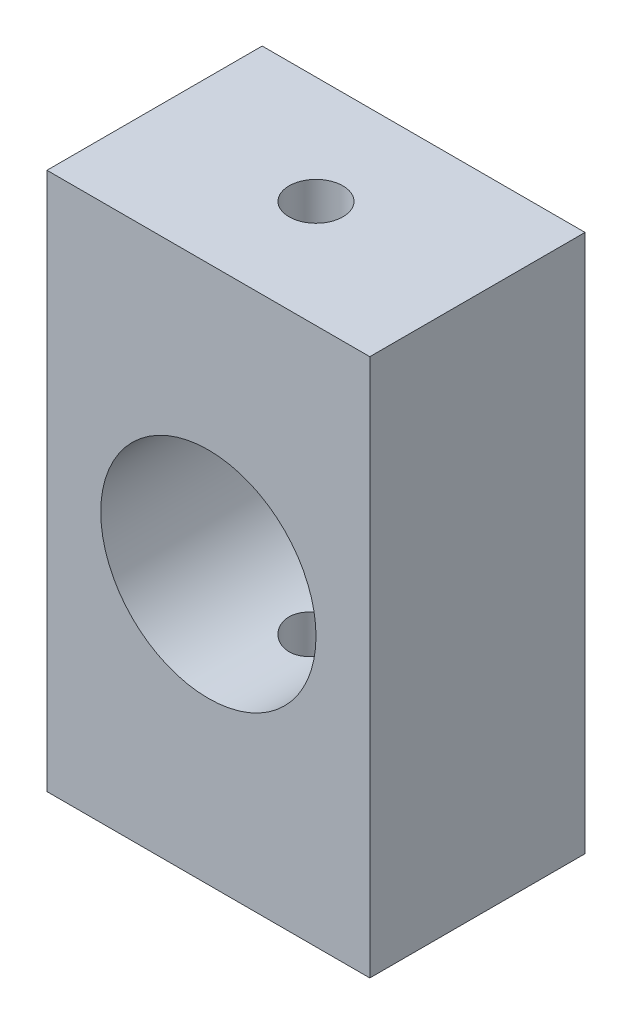
ISO-10303-21;
HEADER;
FILE_DESCRIPTION(('STEP AP214'),'2;1');
FILE_NAME('part.step','',(''),(''),'','','');
FILE_SCHEMA(('AUTOMOTIVE_DESIGN { 1 0 10303 214 1 1 1 1 }'));
ENDSEC;
DATA;
#1=APPLICATION_CONTEXT('core data for automotive mechanical design processes');
#2=APPLICATION_PROTOCOL_DEFINITION('international standard','automotive_design',2000,#1);
#3=PRODUCT_CONTEXT('',#1,'mechanical');
#4=PRODUCT('Part','Part','',(#3));
#5=PRODUCT_RELATED_PRODUCT_CATEGORY('part','',(#4));
#6=PRODUCT_DEFINITION_FORMATION('','',#4);
#7=PRODUCT_DEFINITION_CONTEXT('part definition',#1,'design');
#8=PRODUCT_DEFINITION('design','',#6,#7);
#9=PRODUCT_DEFINITION_SHAPE('','',#8);
#10=(LENGTH_UNIT() NAMED_UNIT(*) SI_UNIT(.MILLI.,.METRE.));
#11=(NAMED_UNIT(*) PLANE_ANGLE_UNIT() SI_UNIT($,.RADIAN.));
#12=(NAMED_UNIT(*) SI_UNIT($,.STERADIAN.) SOLID_ANGLE_UNIT());
#13=UNCERTAINTY_MEASURE_WITH_UNIT(LENGTH_MEASURE(1.E-05),#10,'distance_accuracy_value','');
#14=(GEOMETRIC_REPRESENTATION_CONTEXT(3) GLOBAL_UNCERTAINTY_ASSIGNED_CONTEXT((#13)) GLOBAL_UNIT_ASSIGNED_CONTEXT((#10,
#11,#12)) REPRESENTATION_CONTEXT('',''));
#15=CARTESIAN_POINT('',(0.,0.,0.));
#16=DIRECTION('',(0.,0.,1.));
#17=DIRECTION('',(1.,0.,0.));
#18=AXIS2_PLACEMENT_3D('',#15,#16,#17);
#19=CARTESIAN_POINT('',(0.,0.,20.));
#20=DIRECTION('',(0.,0.,1.));
#21=DIRECTION('',(1.,0.,0.));
#22=AXIS2_PLACEMENT_3D('',#19,#20,#21);
#23=PLANE('',#22);
#24=DIRECTION('',(0.,-1.,0.));
#25=VECTOR('',#24,1.);
#26=CARTESIAN_POINT('',(-15.,25.,20.));
#27=LINE('',#26,#25);
#28=CARTESIAN_POINT('',(-15.,25.,20.));
#29=VERTEX_POINT('',#28);
#30=CARTESIAN_POINT('',(-15.,-25.,20.));
#31=VERTEX_POINT('',#30);
#32=EDGE_CURVE('E101',#29,#31,#27,.T.);
#33=ORIENTED_EDGE('',*,*,#32,.T.);
#34=DIRECTION('',(1.,0.,0.));
#35=VECTOR('',#34,1.);
#36=CARTESIAN_POINT('',(-15.,-25.,20.));
#37=LINE('',#36,#35);
#38=CARTESIAN_POINT('',(15.,-25.,20.));
#39=VERTEX_POINT('',#38);
#40=EDGE_CURVE('E96',#31,#39,#37,.T.);
#41=ORIENTED_EDGE('',*,*,#40,.T.);
#42=DIRECTION('',(0.,1.,0.));
#43=VECTOR('',#42,1.);
#44=CARTESIAN_POINT('',(15.,25.,20.));
#45=LINE('',#44,#43);
#46=CARTESIAN_POINT('',(15.,25.,20.));
#47=VERTEX_POINT('',#46);
#48=EDGE_CURVE('E99',#39,#47,#45,.T.);
#49=ORIENTED_EDGE('',*,*,#48,.T.);
#50=DIRECTION('',(-1.,0.,0.));
#51=VECTOR('',#50,1.);
#52=CARTESIAN_POINT('',(-15.,25.,20.));
#53=LINE('',#52,#51);
#54=EDGE_CURVE('E66',#47,#29,#53,.T.);
#55=ORIENTED_EDGE('',*,*,#54,.T.);
#56=EDGE_LOOP('',(#33,#41,#49,#55));
#57=FACE_BOUND('',#56,.T.);
#58=CARTESIAN_POINT('',(0.,0.,20.));
#59=DIRECTION('',(0.,0.,1.));
#60=DIRECTION('',(1.,0.,0.));
#61=AXIS2_PLACEMENT_3D('',#58,#59,#60);
#62=CIRCLE('',#61,10.);
#63=CARTESIAN_POINT('',(10.,0.,20.));
#64=VERTEX_POINT('',#63);
#65=EDGE_CURVE('E122',#64,#64,#62,.T.);
#66=ORIENTED_EDGE('',*,*,#65,.F.);
#67=EDGE_LOOP('',(#66));
#68=FACE_BOUND('',#67,.T.);
#69=ADVANCED_FACE('F41',(#57,#68),#23,.T.);
#70=CARTESIAN_POINT('',(0.,0.,0.));
#71=DIRECTION('',(0.,0.,1.));
#72=DIRECTION('',(1.,0.,0.));
#73=AXIS2_PLACEMENT_3D('',#70,#71,#72);
#74=PLANE('',#73);
#75=DIRECTION('',(0.,-1.,0.));
#76=VECTOR('',#75,1.);
#77=CARTESIAN_POINT('',(-15.,25.,0.));
#78=LINE('',#77,#76);
#79=CARTESIAN_POINT('',(-15.,25.,0.));
#80=VERTEX_POINT('',#79);
#81=CARTESIAN_POINT('',(-15.,-25.,0.));
#82=VERTEX_POINT('',#81);
#83=EDGE_CURVE('E118',#80,#82,#78,.T.);
#84=ORIENTED_EDGE('',*,*,#83,.F.);
#85=DIRECTION('',(-1.,0.,0.));
#86=VECTOR('',#85,1.);
#87=CARTESIAN_POINT('',(-15.,25.,0.));
#88=LINE('',#87,#86);
#89=CARTESIAN_POINT('',(15.,25.,0.));
#90=VERTEX_POINT('',#89);
#91=EDGE_CURVE('E89',#90,#80,#88,.T.);
#92=ORIENTED_EDGE('',*,*,#91,.F.);
#93=DIRECTION('',(0.,1.,0.));
#94=VECTOR('',#93,1.);
#95=CARTESIAN_POINT('',(15.,25.,0.));
#96=LINE('',#95,#94);
#97=CARTESIAN_POINT('',(15.,-25.,0.));
#98=VERTEX_POINT('',#97);
#99=EDGE_CURVE('E83',#98,#90,#96,.T.);
#100=ORIENTED_EDGE('',*,*,#99,.F.);
#101=DIRECTION('',(1.,0.,0.));
#102=VECTOR('',#101,1.);
#103=CARTESIAN_POINT('',(-15.,-25.,0.));
#104=LINE('',#103,#102);
#105=EDGE_CURVE('E106',#82,#98,#104,.T.);
#106=ORIENTED_EDGE('',*,*,#105,.F.);
#107=EDGE_LOOP('',(#84,#92,#100,#106));
#108=FACE_BOUND('',#107,.T.);
#109=CARTESIAN_POINT('',(0.,0.,0.));
#110=DIRECTION('',(0.,0.,1.));
#111=DIRECTION('',(1.,0.,0.));
#112=AXIS2_PLACEMENT_3D('',#109,#110,#111);
#113=CIRCLE('',#112,10.);
#114=CARTESIAN_POINT('',(10.,0.,0.));
#115=VERTEX_POINT('',#114);
#116=EDGE_CURVE('E187',#115,#115,#113,.T.);
#117=ORIENTED_EDGE('',*,*,#116,.T.);
#118=EDGE_LOOP('',(#117));
#119=FACE_BOUND('',#118,.T.);
#120=ADVANCED_FACE('F157',(#108,#119),#74,.F.);
#121=CARTESIAN_POINT('',(-15.,25.,20.));
#122=DIRECTION('',(1.,0.,0.));
#123=DIRECTION('',(0.,1.,0.));
#124=AXIS2_PLACEMENT_3D('',#121,#122,#123);
#125=PLANE('',#124);
#126=ORIENTED_EDGE('',*,*,#83,.T.);
#127=DIRECTION('',(0.,0.,-1.));
#128=VECTOR('',#127,1.);
#129=CARTESIAN_POINT('',(-15.,-25.,20.));
#130=LINE('',#129,#128);
#131=EDGE_CURVE('E11',#31,#82,#130,.T.);
#132=ORIENTED_EDGE('',*,*,#131,.F.);
#133=ORIENTED_EDGE('',*,*,#32,.F.);
#134=DIRECTION('',(0.,0.,-1.));
#135=VECTOR('',#134,1.);
#136=CARTESIAN_POINT('',(-15.,25.,20.));
#137=LINE('',#136,#135);
#138=EDGE_CURVE('E114',#29,#80,#137,.T.);
#139=ORIENTED_EDGE('',*,*,#138,.T.);
#140=EDGE_LOOP('',(#126,#132,#133,#139));
#141=FACE_BOUND('',#140,.T.);
#142=ADVANCED_FACE('F43',(#141),#125,.F.);
#143=CARTESIAN_POINT('',(-15.,-25.,20.));
#144=DIRECTION('',(0.,1.,0.));
#145=DIRECTION('',(0.,0.,1.));
#146=AXIS2_PLACEMENT_3D('',#143,#144,#145);
#147=PLANE('',#146);
#148=CARTESIAN_POINT('',(0.,-25.,10.));
#149=DIRECTION('',(0.,1.,0.));
#150=DIRECTION('',(0.,0.,1.));
#151=AXIS2_PLACEMENT_3D('',#148,#149,#150);
#152=CIRCLE('',#151,2.5);
#153=CARTESIAN_POINT('',(0.,-25.,12.5));
#154=VERTEX_POINT('',#153);
#155=EDGE_CURVE('E138',#154,#154,#152,.F.);
#156=ORIENTED_EDGE('',*,*,#155,.F.);
#157=EDGE_LOOP('',(#156));
#158=FACE_BOUND('',#157,.T.);
#159=ORIENTED_EDGE('',*,*,#105,.T.);
#160=DIRECTION('',(0.,0.,-1.));
#161=VECTOR('',#160,1.);
#162=CARTESIAN_POINT('',(15.,-25.,20.));
#163=LINE('',#162,#161);
#164=EDGE_CURVE('E57',#39,#98,#163,.T.);
#165=ORIENTED_EDGE('',*,*,#164,.F.);
#166=ORIENTED_EDGE('',*,*,#40,.F.);
#167=ORIENTED_EDGE('',*,*,#131,.T.);
#168=EDGE_LOOP('',(#159,#165,#166,#167));
#169=FACE_BOUND('',#168,.T.);
#170=ADVANCED_FACE('F105',(#158,#169),#147,.F.);
#171=CARTESIAN_POINT('',(15.,25.,20.));
#172=DIRECTION('',(-1.,0.,0.));
#173=DIRECTION('',(0.,-1.,0.));
#174=AXIS2_PLACEMENT_3D('',#171,#172,#173);
#175=PLANE('',#174);
#176=ORIENTED_EDGE('',*,*,#99,.T.);
#177=DIRECTION('',(0.,0.,-1.));
#178=VECTOR('',#177,1.);
#179=CARTESIAN_POINT('',(15.,25.,20.));
#180=LINE('',#179,#178);
#181=EDGE_CURVE('E108',#47,#90,#180,.T.);
#182=ORIENTED_EDGE('',*,*,#181,.F.);
#183=ORIENTED_EDGE('',*,*,#48,.F.);
#184=ORIENTED_EDGE('',*,*,#164,.T.);
#185=EDGE_LOOP('',(#176,#182,#183,#184));
#186=FACE_BOUND('',#185,.T.);
#187=ADVANCED_FACE('F110',(#186),#175,.F.);
#188=CARTESIAN_POINT('',(-15.,25.,20.));
#189=DIRECTION('',(0.,-1.,0.));
#190=DIRECTION('',(1.,0.,0.));
#191=AXIS2_PLACEMENT_3D('',#188,#189,#190);
#192=PLANE('',#191);
#193=CARTESIAN_POINT('',(0.,25.,10.));
#194=DIRECTION('',(0.,1.,0.));
#195=DIRECTION('',(-1.,0.,0.));
#196=AXIS2_PLACEMENT_3D('',#193,#194,#195);
#197=CIRCLE('',#196,2.5);
#198=CARTESIAN_POINT('',(-2.5,25.,10.));
#199=VERTEX_POINT('',#198);
#200=EDGE_CURVE('E178',#199,#199,#197,.T.);
#201=ORIENTED_EDGE('',*,*,#200,.F.);
#202=EDGE_LOOP('',(#201));
#203=FACE_BOUND('',#202,.T.);
#204=ORIENTED_EDGE('',*,*,#91,.T.);
#205=ORIENTED_EDGE('',*,*,#138,.F.);
#206=ORIENTED_EDGE('',*,*,#54,.F.);
#207=ORIENTED_EDGE('',*,*,#181,.T.);
#208=EDGE_LOOP('',(#204,#205,#206,#207));
#209=FACE_BOUND('',#208,.T.);
#210=ADVANCED_FACE('F153',(#203,#209),#192,.F.);
#211=CARTESIAN_POINT('',(0.,0.,20.));
#212=DIRECTION('',(0.,0.,-1.));
#213=DIRECTION('',(-1.,0.,0.));
#214=AXIS2_PLACEMENT_3D('',#211,#212,#213);
#215=CYLINDRICAL_SURFACE('',#214,10.);
#216=CARTESIAN_POINT('',(-2.5,-9.68245836551855,10.));
#217=CARTESIAN_POINT('',(-2.49999607859307,-9.68246100087861,10.1380507509266));
#218=CARTESIAN_POINT('',(-2.48852624549765,-9.68544306014597,10.2761448986785));
#219=CARTESIAN_POINT('',(-2.44302312546379,-9.69701861992564,10.5483675781735));
#220=CARTESIAN_POINT('',(-2.40897670674211,-9.7056153862163,10.6824937544682));
#221=CARTESIAN_POINT('',(-2.31949119963204,-9.7273872459615,10.9428035381872));
#222=CARTESIAN_POINT('',(-2.26407972785449,-9.74055642690458,11.0689971553857));
#223=CARTESIAN_POINT('',(-2.13352114126139,-9.76998192028759,11.3103108525399));
#224=CARTESIAN_POINT('',(-2.05837318856069,-9.78623836378489,11.4254304620802));
#225=CARTESIAN_POINT('',(-1.88870842731188,-9.82040716355625,11.6438616452622));
#226=CARTESIAN_POINT('',(-1.79383688770405,-9.83834597623034,11.74689360035));
#227=CARTESIAN_POINT('',(-1.58818206410066,-9.87362875515294,11.9357613943603));
#228=CARTESIAN_POINT('',(-1.47739729418031,-9.89097266566388,12.0215956256217));
#229=CARTESIAN_POINT('',(-1.24114520107895,-9.92340415520582,12.1747754676313));
#230=CARTESIAN_POINT('',(-1.11549457619512,-9.93845687400592,12.2418463881615));
#231=CARTESIAN_POINT('',(-0.854263184292762,-9.96430811925984,12.3538096441531));
#232=CARTESIAN_POINT('',(-0.71868388579194,-9.97510727334345,12.3987052519155));
#233=CARTESIAN_POINT('',(-0.444358758754161,-9.9910475884818,12.4641478345786));
#234=CARTESIAN_POINT('',(-0.305732719548975,-9.99629893844314,12.4851696443266));
#235=CARTESIAN_POINT('',(-0.0268288192627694,-10.000935941073,12.5037583792756));
#236=CARTESIAN_POINT('',(0.113448794538068,-10.000322460967,12.5013287722096));
#237=CARTESIAN_POINT('',(0.388380617930968,-9.99338094953534,12.4734251497499));
#238=CARTESIAN_POINT('',(0.523090539002667,-9.98718002340871,12.4484636749461));
#239=CARTESIAN_POINT('',(0.786345618534215,-9.96990836524857,12.3770287299515));
#240=CARTESIAN_POINT('',(0.914890448426094,-9.95883737398452,12.3305541146226));
#241=CARTESIAN_POINT('',(1.16351675875452,-9.93287509700884,12.2169974293129));
#242=CARTESIAN_POINT('',(1.28351127441626,-9.91795019695011,12.1497329553383));
#243=CARTESIAN_POINT('',(1.51068905585122,-9.88589903809692,11.9966443208837));
#244=CARTESIAN_POINT('',(1.61787008771376,-9.8687723965265,11.9108169314394));
#245=CARTESIAN_POINT('',(1.81943508771239,-9.83363713769356,11.7202912580176));
#246=CARTESIAN_POINT('',(1.91339419768799,-9.81561719525297,11.6151451076523));
#247=CARTESIAN_POINT('',(2.08244093990755,-9.78115043517327,11.3904000264597));
#248=CARTESIAN_POINT('',(2.15752769011507,-9.76470369108289,11.2708004205089));
#249=CARTESIAN_POINT('',(2.28697032255647,-9.73520496829319,11.0197099658511));
#250=CARTESIAN_POINT('',(2.34122391742612,-9.72216983717007,10.8881642696872));
#251=CARTESIAN_POINT('',(2.42671405159095,-9.70118640148669,10.6174145319232));
#252=CARTESIAN_POINT('',(2.45795551638266,-9.69323700842733,10.4782121360154));
#253=CARTESIAN_POINT('',(2.49582963866592,-9.68355356007457,10.2000404984701));
#254=CARTESIAN_POINT('',(2.50309047391912,-9.68166088976933,10.061162206659));
#255=CARTESIAN_POINT('',(2.49451699051516,-9.68387343364692,9.78417806341474));
#256=CARTESIAN_POINT('',(2.4786847978498,-9.687978095703,9.64607214205056));
#257=CARTESIAN_POINT('',(2.42492546393825,-9.7015708198498,9.37688573505143));
#258=CARTESIAN_POINT('',(2.3873640682819,-9.71096970242532,9.2457272734308));
#259=CARTESIAN_POINT('',(2.29161808167046,-9.73400718262805,8.99156854214667));
#260=CARTESIAN_POINT('',(2.2334310477125,-9.74764628246408,8.86856924094421));
#261=CARTESIAN_POINT('',(2.0967706679366,-9.77796137095511,8.6315587221331));
#262=CARTESIAN_POINT('',(2.01792175383564,-9.79469168607245,8.51777115995702));
#263=CARTESIAN_POINT('',(1.84265073233613,-9.82917083071113,8.30481163719853));
#264=CARTESIAN_POINT('',(1.74622573701359,-9.84691982728307,8.20564208334989));
#265=CARTESIAN_POINT('',(1.53565680246182,-9.88197403031774,8.02218895742908));
#266=CARTESIAN_POINT('',(1.42112988132898,-9.8992570206188,7.9383399374512));
#267=CARTESIAN_POINT('',(1.17925670673669,-9.93097216613689,7.79106413304875));
#268=CARTESIAN_POINT('',(1.05191112239398,-9.94540447003949,7.72763628339179));
#269=CARTESIAN_POINT('',(0.788895504327726,-9.96970115738325,7.62355396547207));
#270=CARTESIAN_POINT('',(0.653293452569705,-9.97959830022409,7.58273571562094));
#271=CARTESIAN_POINT('',(0.376874400797017,-9.99385293395789,7.52453966539159));
#272=CARTESIAN_POINT('',(0.236058412603101,-9.99821149393422,7.50715734126096));
#273=CARTESIAN_POINT('',(-0.0427088161083088,-10.0008542352202,7.49658102606115));
#274=CARTESIAN_POINT('',(-0.180634567415055,-9.99929947199971,7.50274572726148));
#275=CARTESIAN_POINT('',(-0.453418741036878,-9.99064741143608,7.53761956823587));
#276=CARTESIAN_POINT('',(-0.588277254452322,-9.98355027892922,7.56632803753292));
#277=CARTESIAN_POINT('',(-0.850427589111936,-9.96463582134723,7.64513054942715));
#278=CARTESIAN_POINT('',(-0.977756236452158,-9.95284411255981,7.69510863328595));
#279=CARTESIAN_POINT('',(-1.22229263260406,-9.92578222284145,7.81492644754893));
#280=CARTESIAN_POINT('',(-1.33949910316408,-9.91051160346894,7.88476868167621));
#281=CARTESIAN_POINT('',(-1.56350482105826,-9.87768124200718,8.04428808499033));
#282=CARTESIAN_POINT('',(-1.66998747074584,-9.86007542354161,8.13440035725957));
#283=CARTESIAN_POINT('',(-1.86653755068376,-9.82476622642974,8.33105712994336));
#284=CARTESIAN_POINT('',(-1.95660081269148,-9.80706282418256,8.4376057902779));
#285=CARTESIAN_POINT('',(-2.11940506617958,-9.77318689613756,8.66650353547365));
#286=CARTESIAN_POINT('',(-2.19179154854095,-9.75704909183222,8.78911030841313));
#287=CARTESIAN_POINT('',(-2.31481724146367,-9.7285988873707,9.04513872468704));
#288=CARTESIAN_POINT('',(-2.36547227438038,-9.71628370583034,9.17855241523461));
#289=CARTESIAN_POINT('',(-2.43605632142751,-9.69879771876843,9.4264425295879));
#290=CARTESIAN_POINT('',(-2.4599829264922,-9.69271657508747,9.53973291096534));
#291=CARTESIAN_POINT('',(-2.49195573142943,-9.68454596456551,9.76867217249422));
#292=CARTESIAN_POINT('',(-2.50000328592938,-9.6824561572277,9.88432085061101));
#293=CARTESIAN_POINT('',(-2.5,-9.68245836551855,10.));
#294=B_SPLINE_CURVE_WITH_KNOTS('',3,(#216,#217,#218,#219,#220,#221,#222,#223,#224,#225,#226,
#227,#228,#229,#230,#231,#232,#233,#234,#235,#236,#237,#238,#239,#240,#241,#242,#243,#244,#245,
#246,#247,#248,#249,#250,#251,#252,#253,#254,#255,#256,#257,#258,#259,#260,#261,#262,#263,#264,
#265,#266,#267,#268,#269,#270,#271,#272,#273,#274,#275,#276,#277,#278,#279,#280,#281,#282,#283,
#284,#285,#286,#287,#288,#289,#290,#291,#292,#293),.UNSPECIFIED.,.T.,.F.,(4,2,2,2,2,2,2,2,2,2,2,
2,2,2,2,2,2,2,2,2,2,2,2,2,2,2,2,2,2,2,2,2,2,2,2,2,2,2,4),(0.,0.413727441736135,
0.827695741428666,1.24113072716602,1.65458326755479,2.07623954192976,2.49793521479867,
2.9255149639792,3.35303159847092,3.77188750995347,4.19068148666021,4.60018262688947,
5.00970556724786,5.42292874254445,5.83622385468913,6.26070466571912,6.68520531199802,
7.11176432008403,7.53823200129548,7.95343574764205,8.36860127188747,8.77697405014152,
9.18539521426363,9.60182845864102,10.0183301888999,10.4452533097026,10.872154157245,
11.2959207281187,11.7196054891398,12.131834461324,12.5440511738193,12.9540487656466,
13.3640980574302,13.7839709658702,14.2039503157045,14.6317647729113,15.0592672137501,
15.4059782718573,15.7526597510792),.UNSPECIFIED.);
#295=CARTESIAN_POINT('',(-2.5,-9.68245836551855,10.));
#296=VERTEX_POINT('',#295);
#297=EDGE_CURVE('E45',#296,#296,#294,.T.);
#298=ORIENTED_EDGE('',*,*,#297,.F.);
#299=EDGE_LOOP('',(#298));
#300=FACE_BOUND('',#299,.T.);
#301=CARTESIAN_POINT('',(-2.5,9.68245836551854,10.));
#302=CARTESIAN_POINT('',(-2.49999607859307,9.68246100087859,9.86194924907343));
#303=CARTESIAN_POINT('',(-2.48852624549765,9.68544306014597,9.72385510132148));
#304=CARTESIAN_POINT('',(-2.44302312546379,9.69701861992564,9.45163242182649));
#305=CARTESIAN_POINT('',(-2.40897670674211,9.7056153862163,9.31750624553182));
#306=CARTESIAN_POINT('',(-2.31949119963204,9.7273872459615,9.05719646181282));
#307=CARTESIAN_POINT('',(-2.26407972785449,9.74055642690458,8.93100284461429));
#308=CARTESIAN_POINT('',(-2.13352114126139,9.76998192028759,8.68968914746012));
#309=CARTESIAN_POINT('',(-2.05837318856069,9.78623836378489,8.57456953791979));
#310=CARTESIAN_POINT('',(-1.88870842731188,9.82040716355625,8.35613835473779));
#311=CARTESIAN_POINT('',(-1.79383688770405,9.83834597623034,8.25310639964995));
#312=CARTESIAN_POINT('',(-1.58818206410066,9.87362875515294,8.06423860563966));
#313=CARTESIAN_POINT('',(-1.47739729418031,9.89097266566388,7.97840437437825));
#314=CARTESIAN_POINT('',(-1.24114520107896,9.92340415520582,7.82522453236872));
#315=CARTESIAN_POINT('',(-1.11549457619512,9.93845687400592,7.75815361183854));
#316=CARTESIAN_POINT('',(-0.854263184292765,9.96430811925984,7.64619035584692));
#317=CARTESIAN_POINT('',(-0.718683885791944,9.97510727334345,7.60129474808449));
#318=CARTESIAN_POINT('',(-0.444358758754165,9.9910475884818,7.53585216542142));
#319=CARTESIAN_POINT('',(-0.305732719548978,9.99629893844314,7.51483035567342));
#320=CARTESIAN_POINT('',(-0.0268288192627718,10.000935941073,7.49624162072445));
#321=CARTESIAN_POINT('',(0.113448794538066,10.000322460967,7.4986712277904));
#322=CARTESIAN_POINT('',(0.388380617930966,9.99338094953534,7.52657485025014));
#323=CARTESIAN_POINT('',(0.523090539002666,9.98718002340871,7.55153632505386));
#324=CARTESIAN_POINT('',(0.786345618534214,9.96990836524857,7.6229712700485));
#325=CARTESIAN_POINT('',(0.914890448426094,9.95883737398452,7.66944588537741));
#326=CARTESIAN_POINT('',(1.16351675875451,9.93287509700884,7.78300257068706));
#327=CARTESIAN_POINT('',(1.28351127441626,9.91795019695011,7.85026704466174));
#328=CARTESIAN_POINT('',(1.51068905585122,9.88589903809692,8.00335567911626));
#329=CARTESIAN_POINT('',(1.61787008771376,9.8687723965265,8.08918306856063));
#330=CARTESIAN_POINT('',(1.81943508771239,9.83363713769356,8.27970874198237));
#331=CARTESIAN_POINT('',(1.91339419768799,9.81561719525297,8.38485489234774));
#332=CARTESIAN_POINT('',(2.08244093990755,9.78115043517327,8.60959997354028));
#333=CARTESIAN_POINT('',(2.15752769011507,9.76470369108289,8.72919957949111));
#334=CARTESIAN_POINT('',(2.28697032255647,9.73520496829319,8.98029003414886));
#335=CARTESIAN_POINT('',(2.34122391742613,9.72216983717007,9.1118357303128));
#336=CARTESIAN_POINT('',(2.42671405159096,9.70118640148669,9.38258546807684));
#337=CARTESIAN_POINT('',(2.45795551638266,9.69323700842733,9.5217878639846));
#338=CARTESIAN_POINT('',(2.49582963866592,9.68355356007457,9.79995950152992));
#339=CARTESIAN_POINT('',(2.50309047391912,9.68166088976933,9.93883779334102));
#340=CARTESIAN_POINT('',(2.49451699051516,9.68387343364692,10.2158219365853));
#341=CARTESIAN_POINT('',(2.4786847978498,9.687978095703,10.3539278579494));
#342=CARTESIAN_POINT('',(2.42492546393825,9.7015708198498,10.6231142649486));
#343=CARTESIAN_POINT('',(2.38736406828191,9.71096970242532,10.7542727265692));
#344=CARTESIAN_POINT('',(2.29161808167046,9.73400718262805,11.0084314578533));
#345=CARTESIAN_POINT('',(2.23343104771251,9.74764628246408,11.1314307590558));
#346=CARTESIAN_POINT('',(2.0967706679366,9.77796137095511,11.3684412778669));
#347=CARTESIAN_POINT('',(2.01792175383564,9.79469168607245,11.482228840043));
#348=CARTESIAN_POINT('',(1.84265073233613,9.82917083071113,11.6951883628015));
#349=CARTESIAN_POINT('',(1.7462257370136,9.84691982728307,11.7943579166501));
#350=CARTESIAN_POINT('',(1.53565680246182,9.88197403031773,11.9778110425709));
#351=CARTESIAN_POINT('',(1.42112988132899,9.8992570206188,12.0616600625488));
#352=CARTESIAN_POINT('',(1.17925670673669,9.93097216613689,12.2089358669512));
#353=CARTESIAN_POINT('',(1.05191112239398,9.94540447003949,12.2723637166082));
#354=CARTESIAN_POINT('',(0.788895504327734,9.96970115738325,12.3764460345279));
#355=CARTESIAN_POINT('',(0.653293452569713,9.97959830022409,12.4172642843791));
#356=CARTESIAN_POINT('',(0.376874400797024,9.99385293395789,12.4754603346084));
#357=CARTESIAN_POINT('',(0.236058412603108,9.99821149393422,12.492842658739));
#358=CARTESIAN_POINT('',(-0.0427088161083018,10.0008542352202,12.5034189739388));
#359=CARTESIAN_POINT('',(-0.180634567415049,9.99929947199971,12.4972542727385));
#360=CARTESIAN_POINT('',(-0.453418741036872,9.99064741143608,12.4623804317641));
#361=CARTESIAN_POINT('',(-0.588277254452317,9.98355027892923,12.4336719624671));
#362=CARTESIAN_POINT('',(-0.850427589111931,9.96463582134723,12.3548694505728));
#363=CARTESIAN_POINT('',(-0.977756236452152,9.95284411255981,12.3048913667141));
#364=CARTESIAN_POINT('',(-1.22229263260406,9.92578222284145,12.1850735524511));
#365=CARTESIAN_POINT('',(-1.33949910316408,9.91051160346894,12.1152313183238));
#366=CARTESIAN_POINT('',(-1.56350482105826,9.87768124200718,11.9557119150097));
#367=CARTESIAN_POINT('',(-1.66998747074584,9.86007542354161,11.8655996427404));
#368=CARTESIAN_POINT('',(-1.86653755068376,9.82476622642974,11.6689428700566));
#369=CARTESIAN_POINT('',(-1.95660081269147,9.80706282418256,11.5623942097221));
#370=CARTESIAN_POINT('',(-2.11940506617958,9.77318689613756,11.3334964645264));
#371=CARTESIAN_POINT('',(-2.19179154854094,9.75704909183222,11.2108896915869));
#372=CARTESIAN_POINT('',(-2.31481724146367,9.7285988873707,10.954861275313));
#373=CARTESIAN_POINT('',(-2.36547227438038,9.71628370583034,10.8214475847654));
#374=CARTESIAN_POINT('',(-2.43605632142751,9.69879771876843,10.5735574704121));
#375=CARTESIAN_POINT('',(-2.4599829264922,9.69271657508748,10.4602670890347));
#376=CARTESIAN_POINT('',(-2.49195573142942,9.6845459645655,10.2313278275058));
#377=CARTESIAN_POINT('',(-2.50000328592938,9.68245615722769,10.115679149389));
#378=CARTESIAN_POINT('',(-2.5,9.68245836551854,10.));
#379=B_SPLINE_CURVE_WITH_KNOTS('',3,(#301,#302,#303,#304,#305,#306,#307,#308,#309,#310,#311,
#312,#313,#314,#315,#316,#317,#318,#319,#320,#321,#322,#323,#324,#325,#326,#327,#328,#329,#330,
#331,#332,#333,#334,#335,#336,#337,#338,#339,#340,#341,#342,#343,#344,#345,#346,#347,#348,#349,
#350,#351,#352,#353,#354,#355,#356,#357,#358,#359,#360,#361,#362,#363,#364,#365,#366,#367,#368,
#369,#370,#371,#372,#373,#374,#375,#376,#377,#378),.UNSPECIFIED.,.T.,.F.,(4,2,2,2,2,2,2,2,2,2,2,
2,2,2,2,2,2,2,2,2,2,2,2,2,2,2,2,2,2,2,2,2,2,2,2,2,2,2,4),(0.,0.413727441736134,
0.827695741428664,1.24113072716602,1.65458326755478,2.07623954192976,2.49793521479866,
2.9255149639792,3.35303159847092,3.77188750995346,4.1906814866602,4.60018262688947,
5.00970556724786,5.42292874254444,5.83622385468913,6.26070466571911,6.68520531199802,
7.11176432008402,7.53823200129548,7.95343574764204,8.36860127188747,8.77697405014152,
9.18539521426363,9.60182845864102,10.0183301888999,10.4452533097026,10.872154157245,
11.2959207281187,11.7196054891398,12.131834461324,12.5440511738193,12.9540487656466,
13.3640980574302,13.7839709658702,14.2039503157045,14.6317647729113,15.0592672137502,
15.4059782718573,15.7526597510792),.UNSPECIFIED.);
#380=CARTESIAN_POINT('',(-2.5,9.68245836551854,10.));
#381=VERTEX_POINT('',#380);
#382=EDGE_CURVE('E132',#381,#381,#379,.T.);
#383=ORIENTED_EDGE('',*,*,#382,.F.);
#384=EDGE_LOOP('',(#383));
#385=FACE_BOUND('',#384,.T.);
#386=ORIENTED_EDGE('',*,*,#65,.T.);
#387=EDGE_LOOP('',(#386));
#388=FACE_BOUND('',#387,.T.);
#389=ORIENTED_EDGE('',*,*,#116,.F.);
#390=EDGE_LOOP('',(#389));
#391=FACE_BOUND('',#390,.T.);
#392=ADVANCED_FACE('F139',(#300,#385,#388,#391),#215,.F.);
#393=CARTESIAN_POINT('',(0.,-32.0710678118655,10.));
#394=DIRECTION('',(0.,1.,0.));
#395=DIRECTION('',(-1.,0.,0.));
#396=AXIS2_PLACEMENT_3D('',#393,#394,#395);
#397=CYLINDRICAL_SURFACE('',#396,2.5);
#398=ORIENTED_EDGE('',*,*,#382,.T.);
#399=EDGE_LOOP('',(#398));
#400=FACE_BOUND('',#399,.T.);
#401=ORIENTED_EDGE('',*,*,#200,.T.);
#402=EDGE_LOOP('',(#401));
#403=FACE_BOUND('',#402,.T.);
#404=ADVANCED_FACE('F142',(#400,#403),#397,.F.);
#405=ORIENTED_EDGE('',*,*,#297,.T.);
#406=EDGE_LOOP('',(#405));
#407=FACE_BOUND('',#406,.T.);
#408=ORIENTED_EDGE('',*,*,#155,.T.);
#409=EDGE_LOOP('',(#408));
#410=FACE_BOUND('',#409,.T.);
#411=ADVANCED_FACE('F145',(#407,#410),#397,.F.);
#412=CLOSED_SHELL('',(#69,#120,#142,#170,#187,#210,#392,#404,#411));
#413=MANIFOLD_SOLID_BREP('B2',#412);
#414=ADVANCED_BREP_SHAPE_REPRESENTATION('',(#18,#413),#14);
#415=SHAPE_DEFINITION_REPRESENTATION(#9,#414);
ENDSEC;
END-ISO-10303-21;
